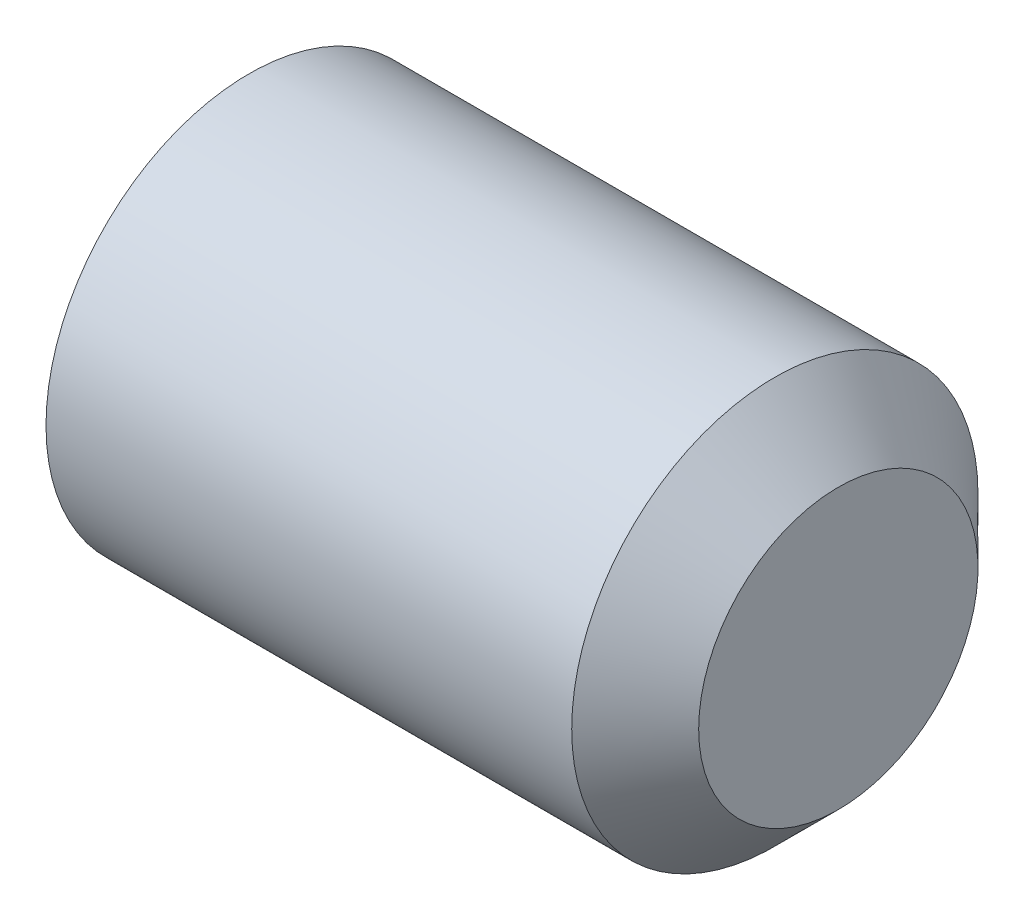
ISO-10303-21;
HEADER;
FILE_DESCRIPTION(('STEP AP214'),'2;1');
FILE_NAME('part.step','',(''),(''),'','','');
FILE_SCHEMA(('AUTOMOTIVE_DESIGN { 1 0 10303 214 1 1 1 1 }'));
ENDSEC;
DATA;
#1=APPLICATION_CONTEXT('core data for automotive mechanical design processes');
#2=APPLICATION_PROTOCOL_DEFINITION('international standard','automotive_design',2000,#1);
#3=PRODUCT_CONTEXT('',#1,'mechanical');
#4=PRODUCT('Part','Part','',(#3));
#5=PRODUCT_RELATED_PRODUCT_CATEGORY('part','',(#4));
#6=PRODUCT_DEFINITION_FORMATION('','',#4);
#7=PRODUCT_DEFINITION_CONTEXT('part definition',#1,'design');
#8=PRODUCT_DEFINITION('design','',#6,#7);
#9=PRODUCT_DEFINITION_SHAPE('','',#8);
#10=(LENGTH_UNIT() NAMED_UNIT(*) SI_UNIT(.MILLI.,.METRE.));
#11=(NAMED_UNIT(*) PLANE_ANGLE_UNIT() SI_UNIT($,.RADIAN.));
#12=(NAMED_UNIT(*) SI_UNIT($,.STERADIAN.) SOLID_ANGLE_UNIT());
#13=UNCERTAINTY_MEASURE_WITH_UNIT(LENGTH_MEASURE(1.E-05),#10,'distance_accuracy_value','');
#14=(GEOMETRIC_REPRESENTATION_CONTEXT(3) GLOBAL_UNCERTAINTY_ASSIGNED_CONTEXT((#13)) GLOBAL_UNIT_ASSIGNED_CONTEXT((#10,
#11,#12)) REPRESENTATION_CONTEXT('',''));
#15=CARTESIAN_POINT('',(0.,0.,0.));
#16=DIRECTION('',(0.,0.,1.));
#17=DIRECTION('',(1.,0.,0.));
#18=AXIS2_PLACEMENT_3D('',#15,#16,#17);
#19=CARTESIAN_POINT('',(0.,0.,0.));
#20=DIRECTION('',(-1.,0.,0.));
#21=DIRECTION('',(0.,0.,1.));
#22=AXIS2_PLACEMENT_3D('',#19,#20,#21);
#23=PLANE('',#22);
#24=CARTESIAN_POINT('',(0.,0.,0.));
#25=DIRECTION('',(-1.,0.,0.));
#26=DIRECTION('',(0.,0.,1.));
#27=AXIS2_PLACEMENT_3D('',#24,#25,#26);
#28=CIRCLE('',#27,3.3095);
#29=CARTESIAN_POINT('',(0.,0.,3.3095));
#30=VERTEX_POINT('',#29);
#31=EDGE_CURVE('E138',#30,#30,#28,.T.);
#32=ORIENTED_EDGE('',*,*,#31,.T.);
#33=EDGE_LOOP('',(#32));
#34=FACE_BOUND('',#33,.T.);
#35=DIRECTION('',(0.,0.,-1.));
#36=VECTOR('',#35,1.);
#37=CARTESIAN_POINT('',(0.,2.,1.15470053837925));
#38=LINE('',#37,#36);
#39=CARTESIAN_POINT('',(0.,2.,1.15470053837925));
#40=VERTEX_POINT('',#39);
#41=CARTESIAN_POINT('',(0.,2.,-1.15470053837925));
#42=VERTEX_POINT('',#41);
#43=EDGE_CURVE('E129',#40,#42,#38,.T.);
#44=ORIENTED_EDGE('',*,*,#43,.F.);
#45=DIRECTION('',(0.,-0.866025403784439,0.5));
#46=VECTOR('',#45,1.);
#47=CARTESIAN_POINT('',(0.,2.,1.15470053837925));
#48=LINE('',#47,#46);
#49=CARTESIAN_POINT('',(0.,0.,2.3094010767585));
#50=VERTEX_POINT('',#49);
#51=EDGE_CURVE('E51',#40,#50,#48,.T.);
#52=ORIENTED_EDGE('',*,*,#51,.T.);
#53=DIRECTION('',(0.,0.866025403784439,0.5));
#54=VECTOR('',#53,1.);
#55=CARTESIAN_POINT('',(0.,-2.,1.15470053837925));
#56=LINE('',#55,#54);
#57=CARTESIAN_POINT('',(0.,-2.,1.15470053837925));
#58=VERTEX_POINT('',#57);
#59=EDGE_CURVE('E120',#58,#50,#56,.T.);
#60=ORIENTED_EDGE('',*,*,#59,.F.);
#61=DIRECTION('',(0.,0.,-1.));
#62=VECTOR('',#61,1.);
#63=CARTESIAN_POINT('',(0.,-2.,1.15470053837925));
#64=LINE('',#63,#62);
#65=CARTESIAN_POINT('',(0.,-2.,-1.15470053837925));
#66=VERTEX_POINT('',#65);
#67=EDGE_CURVE('E123',#58,#66,#64,.T.);
#68=ORIENTED_EDGE('',*,*,#67,.T.);
#69=DIRECTION('',(0.,0.866025403784439,-0.5));
#70=VECTOR('',#69,1.);
#71=CARTESIAN_POINT('',(0.,-2.,-1.15470053837925));
#72=LINE('',#71,#70);
#73=CARTESIAN_POINT('',(0.,0.,-2.30940107675851));
#74=VERTEX_POINT('',#73);
#75=EDGE_CURVE('E126',#66,#74,#72,.T.);
#76=ORIENTED_EDGE('',*,*,#75,.T.);
#77=DIRECTION('',(0.,-0.866025403784439,-0.5));
#78=VECTOR('',#77,1.);
#79=CARTESIAN_POINT('',(0.,2.,-1.15470053837925));
#80=LINE('',#79,#78);
#81=EDGE_CURVE('E109',#42,#74,#80,.T.);
#82=ORIENTED_EDGE('',*,*,#81,.F.);
#83=EDGE_LOOP('',(#44,#52,#60,#68,#76,#82));
#84=FACE_BOUND('',#83,.T.);
#85=ADVANCED_FACE('F36',(#34,#84),#23,.T.);
#86=CARTESIAN_POINT('',(12.,2.75,0.));
#87=DIRECTION('',(1.,0.,0.));
#88=DIRECTION('',(0.,0.,-1.));
#89=AXIS2_PLACEMENT_3D('',#86,#87,#88);
#90=PLANE('',#89);
#91=CARTESIAN_POINT('',(12.,0.,0.));
#92=DIRECTION('',(-1.,0.,0.));
#93=DIRECTION('',(0.,0.,1.));
#94=AXIS2_PLACEMENT_3D('',#91,#92,#93);
#95=CIRCLE('',#94,2.75);
#96=CARTESIAN_POINT('',(12.,0.,2.75));
#97=VERTEX_POINT('',#96);
#98=EDGE_CURVE('E11',#97,#97,#95,.T.);
#99=ORIENTED_EDGE('',*,*,#98,.F.);
#100=EDGE_LOOP('',(#99));
#101=FACE_BOUND('',#100,.T.);
#102=ADVANCED_FACE('F38',(#101),#90,.T.);
#103=CARTESIAN_POINT('',(10.75,0.,0.));
#104=DIRECTION('',(-1.,0.,0.));
#105=DIRECTION('',(0.,0.,1.));
#106=AXIS2_PLACEMENT_3D('',#103,#104,#105);
#107=CONICAL_SURFACE('',#106,4.,0.785398163397448);
#108=ORIENTED_EDGE('',*,*,#98,.T.);
#109=EDGE_LOOP('',(#108));
#110=FACE_BOUND('',#109,.T.);
#111=CARTESIAN_POINT('',(10.75,0.,0.));
#112=DIRECTION('',(-1.,0.,0.));
#113=DIRECTION('',(0.,0.,1.));
#114=AXIS2_PLACEMENT_3D('',#111,#112,#113);
#115=CIRCLE('',#114,4.);
#116=CARTESIAN_POINT('',(10.75,0.,4.));
#117=VERTEX_POINT('',#116);
#118=EDGE_CURVE('E44',#117,#117,#115,.T.);
#119=ORIENTED_EDGE('',*,*,#118,.F.);
#120=EDGE_LOOP('',(#119));
#121=FACE_BOUND('',#120,.T.);
#122=ADVANCED_FACE('F149',(#110,#121),#107,.T.);
#123=CARTESIAN_POINT('',(-12.7,0.,0.));
#124=DIRECTION('',(-1.,0.,0.));
#125=DIRECTION('',(0.,0.,1.));
#126=AXIS2_PLACEMENT_3D('',#123,#124,#125);
#127=CYLINDRICAL_SURFACE('',#126,4.);
#128=ORIENTED_EDGE('',*,*,#118,.T.);
#129=EDGE_LOOP('',(#128));
#130=FACE_BOUND('',#129,.T.);
#131=CARTESIAN_POINT('',(0.398660360875434,0.,0.));
#132=DIRECTION('',(-1.,0.,0.));
#133=DIRECTION('',(0.,0.,1.));
#134=AXIS2_PLACEMENT_3D('',#131,#132,#133);
#135=CIRCLE('',#134,4.);
#136=CARTESIAN_POINT('',(0.398660360875434,0.,4.));
#137=VERTEX_POINT('',#136);
#138=EDGE_CURVE('E141',#137,#137,#135,.T.);
#139=ORIENTED_EDGE('',*,*,#138,.F.);
#140=EDGE_LOOP('',(#139));
#141=FACE_BOUND('',#140,.T.);
#142=ADVANCED_FACE('F146',(#130,#141),#127,.T.);
#143=CARTESIAN_POINT('',(0.,0.,0.));
#144=DIRECTION('',(1.,0.,0.));
#145=DIRECTION('',(0.,0.,-1.));
#146=AXIS2_PLACEMENT_3D('',#143,#144,#145);
#147=CONICAL_SURFACE('',#146,3.3095,1.0471975511966);
#148=ORIENTED_EDGE('',*,*,#138,.T.);
#149=EDGE_LOOP('',(#148));
#150=FACE_BOUND('',#149,.T.);
#151=ORIENTED_EDGE('',*,*,#31,.F.);
#152=EDGE_LOOP('',(#151));
#153=FACE_BOUND('',#152,.T.);
#154=ADVANCED_FACE('F156',(#150,#153),#147,.T.);
#155=CARTESIAN_POINT('',(5.,2.,1.15470053837925));
#156=DIRECTION('',(0.,-0.5,-0.866025403784439));
#157=DIRECTION('',(0.,0.866025403784439,-0.5));
#158=AXIS2_PLACEMENT_3D('',#155,#156,#157);
#159=PLANE('',#158);
#160=ORIENTED_EDGE('',*,*,#51,.F.);
#161=DIRECTION('',(-1.,0.,0.));
#162=VECTOR('',#161,1.);
#163=CARTESIAN_POINT('',(5.,2.,1.15470053837925));
#164=LINE('',#163,#162);
#165=CARTESIAN_POINT('',(5.,2.,1.15470053837925));
#166=VERTEX_POINT('',#165);
#167=EDGE_CURVE('E56',#166,#40,#164,.T.);
#168=ORIENTED_EDGE('',*,*,#167,.F.);
#169=DIRECTION('',(0.,-0.866025403784439,0.5));
#170=VECTOR('',#169,1.);
#171=CARTESIAN_POINT('',(5.,2.,1.15470053837925));
#172=LINE('',#171,#170);
#173=CARTESIAN_POINT('',(5.,0.,2.3094010767585));
#174=VERTEX_POINT('',#173);
#175=EDGE_CURVE('E83',#166,#174,#172,.T.);
#176=ORIENTED_EDGE('',*,*,#175,.T.);
#177=DIRECTION('',(-1.,0.,0.));
#178=VECTOR('',#177,1.);
#179=CARTESIAN_POINT('',(5.,0.,2.3094010767585));
#180=LINE('',#179,#178);
#181=EDGE_CURVE('E136',#174,#50,#180,.T.);
#182=ORIENTED_EDGE('',*,*,#181,.T.);
#183=EDGE_LOOP('',(#160,#168,#176,#182));
#184=FACE_BOUND('',#183,.T.);
#185=ADVANCED_FACE('F167',(#184),#159,.T.);
#186=CARTESIAN_POINT('',(5.,-2.,1.15470053837925));
#187=DIRECTION('',(0.,-0.5,0.866025403784439));
#188=DIRECTION('',(0.,-0.866025403784439,-0.5));
#189=AXIS2_PLACEMENT_3D('',#186,#187,#188);
#190=PLANE('',#189);
#191=ORIENTED_EDGE('',*,*,#59,.T.);
#192=ORIENTED_EDGE('',*,*,#181,.F.);
#193=DIRECTION('',(0.,0.866025403784439,0.5));
#194=VECTOR('',#193,1.);
#195=CARTESIAN_POINT('',(5.,-2.,1.15470053837925));
#196=LINE('',#195,#194);
#197=CARTESIAN_POINT('',(5.,-2.,1.15470053837925));
#198=VERTEX_POINT('',#197);
#199=EDGE_CURVE('E267',#198,#174,#196,.T.);
#200=ORIENTED_EDGE('',*,*,#199,.F.);
#201=DIRECTION('',(-1.,0.,0.));
#202=VECTOR('',#201,1.);
#203=CARTESIAN_POINT('',(5.,-2.,1.15470053837925));
#204=LINE('',#203,#202);
#205=EDGE_CURVE('E134',#198,#58,#204,.T.);
#206=ORIENTED_EDGE('',*,*,#205,.T.);
#207=EDGE_LOOP('',(#191,#192,#200,#206));
#208=FACE_BOUND('',#207,.T.);
#209=ADVANCED_FACE('F174',(#208),#190,.F.);
#210=CARTESIAN_POINT('',(5.,-2.,1.15470053837925));
#211=DIRECTION('',(0.,1.,0.));
#212=DIRECTION('',(0.,0.,1.));
#213=AXIS2_PLACEMENT_3D('',#210,#211,#212);
#214=PLANE('',#213);
#215=ORIENTED_EDGE('',*,*,#67,.F.);
#216=ORIENTED_EDGE('',*,*,#205,.F.);
#217=DIRECTION('',(0.,0.,-1.));
#218=VECTOR('',#217,1.);
#219=CARTESIAN_POINT('',(5.,-2.,1.15470053837925));
#220=LINE('',#219,#218);
#221=CARTESIAN_POINT('',(5.,-2.,-1.15470053837925));
#222=VERTEX_POINT('',#221);
#223=EDGE_CURVE('E104',#198,#222,#220,.T.);
#224=ORIENTED_EDGE('',*,*,#223,.T.);
#225=DIRECTION('',(-1.,0.,0.));
#226=VECTOR('',#225,1.);
#227=CARTESIAN_POINT('',(5.,-2.,-1.15470053837925));
#228=LINE('',#227,#226);
#229=EDGE_CURVE('E99',#222,#66,#228,.T.);
#230=ORIENTED_EDGE('',*,*,#229,.T.);
#231=EDGE_LOOP('',(#215,#216,#224,#230));
#232=FACE_BOUND('',#231,.T.);
#233=ADVANCED_FACE('F181',(#232),#214,.T.);
#234=CARTESIAN_POINT('',(5.,-2.,-1.15470053837925));
#235=DIRECTION('',(0.,0.5,0.866025403784439));
#236=DIRECTION('',(0.,-0.866025403784439,0.5));
#237=AXIS2_PLACEMENT_3D('',#234,#235,#236);
#238=PLANE('',#237);
#239=ORIENTED_EDGE('',*,*,#75,.F.);
#240=ORIENTED_EDGE('',*,*,#229,.F.);
#241=DIRECTION('',(0.,0.866025403784439,-0.5));
#242=VECTOR('',#241,1.);
#243=CARTESIAN_POINT('',(5.,-2.,-1.15470053837925));
#244=LINE('',#243,#242);
#245=CARTESIAN_POINT('',(5.,0.,-2.30940107675851));
#246=VERTEX_POINT('',#245);
#247=EDGE_CURVE('E94',#222,#246,#244,.T.);
#248=ORIENTED_EDGE('',*,*,#247,.T.);
#249=DIRECTION('',(-1.,0.,0.));
#250=VECTOR('',#249,1.);
#251=CARTESIAN_POINT('',(5.,0.,-2.30940107675851));
#252=LINE('',#251,#250);
#253=EDGE_CURVE('E98',#246,#74,#252,.T.);
#254=ORIENTED_EDGE('',*,*,#253,.T.);
#255=EDGE_LOOP('',(#239,#240,#248,#254));
#256=FACE_BOUND('',#255,.T.);
#257=ADVANCED_FACE('F97',(#256),#238,.T.);
#258=CARTESIAN_POINT('',(5.,2.,-1.15470053837925));
#259=DIRECTION('',(0.,0.5,-0.866025403784439));
#260=DIRECTION('',(0.,0.866025403784439,0.5));
#261=AXIS2_PLACEMENT_3D('',#258,#259,#260);
#262=PLANE('',#261);
#263=ORIENTED_EDGE('',*,*,#81,.T.);
#264=ORIENTED_EDGE('',*,*,#253,.F.);
#265=DIRECTION('',(0.,-0.866025403784439,-0.5));
#266=VECTOR('',#265,1.);
#267=CARTESIAN_POINT('',(5.,2.,-1.15470053837925));
#268=LINE('',#267,#266);
#269=CARTESIAN_POINT('',(5.,2.,-1.15470053837925));
#270=VERTEX_POINT('',#269);
#271=EDGE_CURVE('E103',#270,#246,#268,.T.);
#272=ORIENTED_EDGE('',*,*,#271,.F.);
#273=DIRECTION('',(-1.,0.,0.));
#274=VECTOR('',#273,1.);
#275=CARTESIAN_POINT('',(5.,2.,-1.15470053837925));
#276=LINE('',#275,#274);
#277=EDGE_CURVE('E79',#270,#42,#276,.T.);
#278=ORIENTED_EDGE('',*,*,#277,.T.);
#279=EDGE_LOOP('',(#263,#264,#272,#278));
#280=FACE_BOUND('',#279,.T.);
#281=ADVANCED_FACE('F106',(#280),#262,.F.);
#282=CARTESIAN_POINT('',(5.,2.,1.15470053837925));
#283=DIRECTION('',(0.,1.,0.));
#284=DIRECTION('',(0.,0.,1.));
#285=AXIS2_PLACEMENT_3D('',#282,#283,#284);
#286=PLANE('',#285);
#287=ORIENTED_EDGE('',*,*,#43,.T.);
#288=ORIENTED_EDGE('',*,*,#277,.F.);
#289=DIRECTION('',(0.,0.,-1.));
#290=VECTOR('',#289,1.);
#291=CARTESIAN_POINT('',(5.,2.,1.15470053837925));
#292=LINE('',#291,#290);
#293=EDGE_CURVE('E114',#166,#270,#292,.T.);
#294=ORIENTED_EDGE('',*,*,#293,.F.);
#295=ORIENTED_EDGE('',*,*,#167,.T.);
#296=EDGE_LOOP('',(#287,#288,#294,#295));
#297=FACE_BOUND('',#296,.T.);
#298=ADVANCED_FACE('F193',(#297),#286,.F.);
#299=CARTESIAN_POINT('',(5.,2.,1.15470053837925));
#300=DIRECTION('',(1.,0.,0.));
#301=DIRECTION('',(0.,0.,-1.));
#302=AXIS2_PLACEMENT_3D('',#299,#300,#301);
#303=PLANE('',#302);
#304=ORIENTED_EDGE('',*,*,#175,.F.);
#305=ORIENTED_EDGE('',*,*,#293,.T.);
#306=ORIENTED_EDGE('',*,*,#271,.T.);
#307=ORIENTED_EDGE('',*,*,#247,.F.);
#308=ORIENTED_EDGE('',*,*,#223,.F.);
#309=ORIENTED_EDGE('',*,*,#199,.T.);
#310=EDGE_LOOP('',(#304,#305,#306,#307,#308,#309));
#311=FACE_BOUND('',#310,.T.);
#312=ADVANCED_FACE('F112',(#311),#303,.F.);
#313=CLOSED_SHELL('',(#85,#102,#122,#142,#154,#185,#209,#233,#257,#281,#298,#312));
#314=MANIFOLD_SOLID_BREP('B2',#313);
#315=ADVANCED_BREP_SHAPE_REPRESENTATION('',(#18,#314),#14);
#316=SHAPE_DEFINITION_REPRESENTATION(#9,#315);
ENDSEC;
END-ISO-10303-21;
